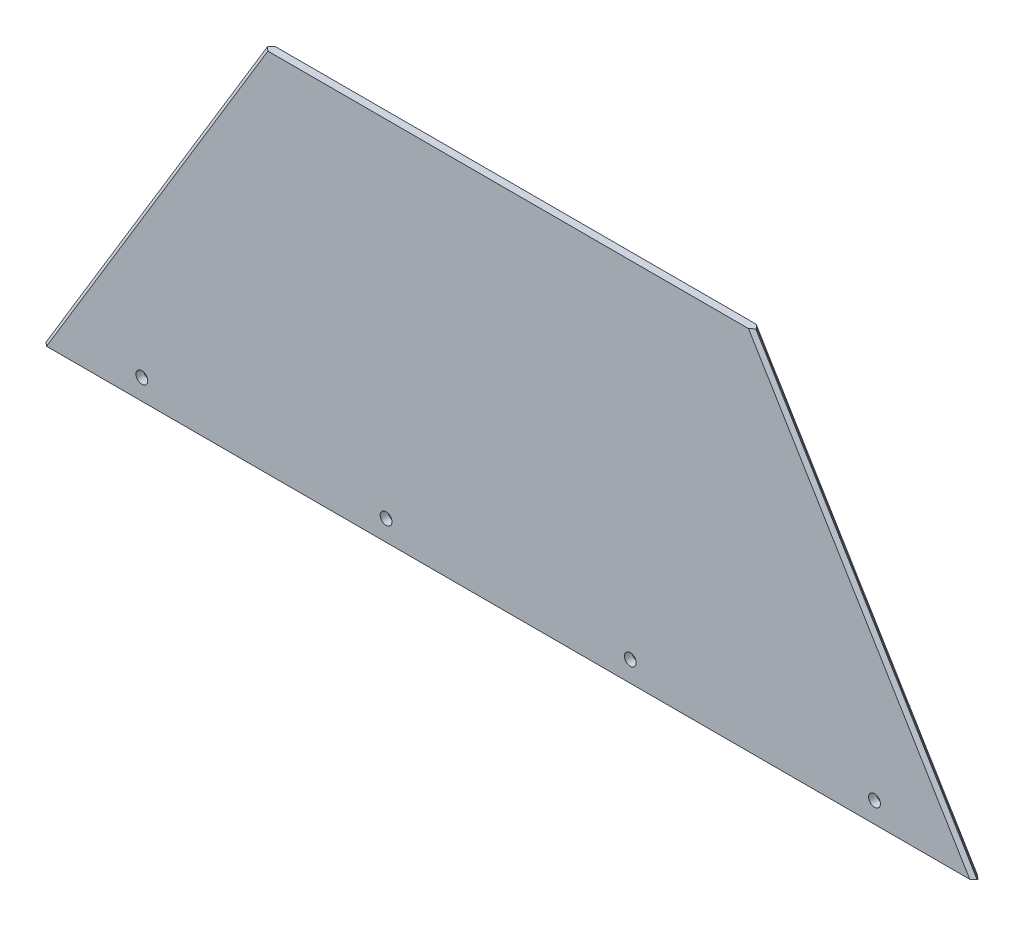
ISO-10303-21;
HEADER;
FILE_DESCRIPTION(('STEP AP214'),'2;1');
FILE_NAME('part.step','',(''),(''),'','','');
FILE_SCHEMA(('AUTOMOTIVE_DESIGN { 1 0 10303 214 1 1 1 1 }'));
ENDSEC;
DATA;
#1=APPLICATION_CONTEXT('core data for automotive mechanical design processes');
#2=APPLICATION_PROTOCOL_DEFINITION('international standard','automotive_design',2000,#1);
#3=PRODUCT_CONTEXT('',#1,'mechanical');
#4=PRODUCT('Part','Part','',(#3));
#5=PRODUCT_RELATED_PRODUCT_CATEGORY('part','',(#4));
#6=PRODUCT_DEFINITION_FORMATION('','',#4);
#7=PRODUCT_DEFINITION_CONTEXT('part definition',#1,'design');
#8=PRODUCT_DEFINITION('design','',#6,#7);
#9=PRODUCT_DEFINITION_SHAPE('','',#8);
#10=(LENGTH_UNIT() NAMED_UNIT(*) SI_UNIT(.MILLI.,.METRE.));
#11=(NAMED_UNIT(*) PLANE_ANGLE_UNIT() SI_UNIT($,.RADIAN.));
#12=(NAMED_UNIT(*) SI_UNIT($,.STERADIAN.) SOLID_ANGLE_UNIT());
#13=UNCERTAINTY_MEASURE_WITH_UNIT(LENGTH_MEASURE(1.E-05),#10,'distance_accuracy_value','');
#14=(GEOMETRIC_REPRESENTATION_CONTEXT(3) GLOBAL_UNCERTAINTY_ASSIGNED_CONTEXT((#13)) GLOBAL_UNIT_ASSIGNED_CONTEXT((#10,
#11,#12)) REPRESENTATION_CONTEXT('',''));
#15=CARTESIAN_POINT('',(0.,0.,0.));
#16=DIRECTION('',(0.,0.,1.));
#17=DIRECTION('',(1.,0.,0.));
#18=AXIS2_PLACEMENT_3D('',#15,#16,#17);
#19=CARTESIAN_POINT('',(0.,0.,1.5875));
#20=DIRECTION('',(0.,1.,0.));
#21=DIRECTION('',(0.,0.,1.));
#22=AXIS2_PLACEMENT_3D('',#19,#20,#21);
#23=PLANE('',#22);
#24=DIRECTION('',(1.,0.,0.));
#25=VECTOR('',#24,1.);
#26=CARTESIAN_POINT('',(0.,0.,-1.5875));
#27=LINE('',#26,#25);
#28=CARTESIAN_POINT('',(-192.042829614562,0.,-1.5875));
#29=VERTEX_POINT('',#28);
#30=CARTESIAN_POINT('',(192.042829614562,0.,-1.58750000000003));
#31=VERTEX_POINT('',#30);
#32=EDGE_CURVE('E170',#29,#31,#27,.T.);
#33=ORIENTED_EDGE('',*,*,#32,.T.);
#34=DIRECTION('',(-0.759717133516372,0.,-0.650253702059179));
#35=VECTOR('',#34,1.);
#36=CARTESIAN_POINT('',(193.675,0.,-0.190499999999963));
#37=LINE('',#36,#35);
#38=CARTESIAN_POINT('',(193.675,0.,-0.190499999999963));
#39=VERTEX_POINT('',#38);
#40=EDGE_CURVE('E144',#31,#39,#37,.F.);
#41=ORIENTED_EDGE('',*,*,#40,.T.);
#42=DIRECTION('',(0.,0.,-1.));
#43=VECTOR('',#42,1.);
#44=CARTESIAN_POINT('',(193.675,0.,1.5875));
#45=LINE('',#44,#43);
#46=CARTESIAN_POINT('',(193.675,0.,0.190499999999958));
#47=VERTEX_POINT('',#46);
#48=EDGE_CURVE('E123',#47,#39,#45,.T.);
#49=ORIENTED_EDGE('',*,*,#48,.F.);
#50=DIRECTION('',(-0.759717133516387,0.,0.650253702059161));
#51=VECTOR('',#50,1.);
#52=CARTESIAN_POINT('',(192.294739193228,0.,1.37188667645438));
#53=LINE('',#52,#51);
#54=CARTESIAN_POINT('',(192.042829614562,0.,1.58750000000006));
#55=VERTEX_POINT('',#54);
#56=EDGE_CURVE('E128',#47,#55,#53,.T.);
#57=ORIENTED_EDGE('',*,*,#56,.T.);
#58=DIRECTION('',(1.,0.,0.));
#59=VECTOR('',#58,1.);
#60=CARTESIAN_POINT('',(-193.675,0.,1.5875));
#61=LINE('',#60,#59);
#62=CARTESIAN_POINT('',(-192.042829614562,0.,1.58749999999999));
#63=VERTEX_POINT('',#62);
#64=EDGE_CURVE('E165',#63,#55,#61,.T.);
#65=ORIENTED_EDGE('',*,*,#64,.F.);
#66=DIRECTION('',(-0.759717133516385,0.,-0.650253702059163));
#67=VECTOR('',#66,1.);
#68=CARTESIAN_POINT('',(-132.5110449374,0.,52.5416797449515));
#69=LINE('',#68,#67);
#70=CARTESIAN_POINT('',(-193.675,0.,0.190499999999851));
#71=VERTEX_POINT('',#70);
#72=EDGE_CURVE('E58',#63,#71,#69,.T.);
#73=ORIENTED_EDGE('',*,*,#72,.T.);
#74=DIRECTION('',(0.,0.,-1.));
#75=VECTOR('',#74,1.);
#76=CARTESIAN_POINT('',(-193.675,0.,1.5875));
#77=LINE('',#76,#75);
#78=CARTESIAN_POINT('',(-193.675,0.,-0.190500000000031));
#79=VERTEX_POINT('',#78);
#80=EDGE_CURVE('E155',#71,#79,#77,.T.);
#81=ORIENTED_EDGE('',*,*,#80,.T.);
#82=DIRECTION('',(-0.759717133516378,0.,0.650253702059172));
#83=VECTOR('',#82,1.);
#84=CARTESIAN_POINT('',(-140.532060928611,0.,-45.6763674958803));
#85=LINE('',#84,#83);
#86=EDGE_CURVE('E51',#79,#29,#85,.F.);
#87=ORIENTED_EDGE('',*,*,#86,.T.);
#88=EDGE_LOOP('',(#33,#41,#49,#57,#65,#73,#81,#87));
#89=FACE_BOUND('',#88,.T.);
#90=ADVANCED_FACE('F36',(#89),#23,.F.);
#91=CARTESIAN_POINT('',(193.675,0.,1.5875));
#92=DIRECTION('',(-0.855915541945791,-0.517115639925582,0.));
#93=DIRECTION('',(0.517115639925582,-0.855915541945791,0.));
#94=AXIS2_PLACEMENT_3D('',#91,#92,#93);
#95=PLANE('',#94);
#96=ORIENTED_EDGE('',*,*,#48,.T.);
#97=DIRECTION('',(-0.517115639925582,0.855915541945791,0.));
#98=VECTOR('',#97,1.);
#99=CARTESIAN_POINT('',(193.675,0.,-0.190499999999965));
#100=LINE('',#99,#98);
#101=CARTESIAN_POINT('',(101.6,152.4,-0.190499999999979));
#102=VERTEX_POINT('',#101);
#103=EDGE_CURVE('E122',#39,#102,#100,.T.);
#104=ORIENTED_EDGE('',*,*,#103,.T.);
#105=DIRECTION('',(0.,0.,-1.));
#106=VECTOR('',#105,1.);
#107=CARTESIAN_POINT('',(101.6,152.4,1.5875));
#108=LINE('',#107,#106);
#109=CARTESIAN_POINT('',(101.6,152.4,0.190499999999963));
#110=VERTEX_POINT('',#109);
#111=EDGE_CURVE('E105',#110,#102,#108,.T.);
#112=ORIENTED_EDGE('',*,*,#111,.F.);
#113=DIRECTION('',(0.517115639925582,-0.855915541945791,0.));
#114=VECTOR('',#113,1.);
#115=CARTESIAN_POINT('',(193.675,0.,0.190499999999963));
#116=LINE('',#115,#114);
#117=EDGE_CURVE('E119',#110,#47,#116,.T.);
#118=ORIENTED_EDGE('',*,*,#117,.T.);
#119=EDGE_LOOP('',(#96,#104,#112,#118));
#120=FACE_BOUND('',#119,.T.);
#121=ADVANCED_FACE('F118',(#120),#95,.F.);
#122=CARTESIAN_POINT('',(0.,152.4,1.5875));
#123=DIRECTION('',(0.,-1.,0.));
#124=DIRECTION('',(0.,0.,-1.));
#125=AXIS2_PLACEMENT_3D('',#122,#123,#124);
#126=PLANE('',#125);
#127=ORIENTED_EDGE('',*,*,#111,.T.);
#128=DIRECTION('',(0.759717133516372,0.,0.650253702059179));
#129=VECTOR('',#128,1.);
#130=CARTESIAN_POINT('',(154.742939071388,152.4,45.2953674958804));
#131=LINE('',#130,#129);
#132=CARTESIAN_POINT('',(99.9678296145621,152.4,-1.5875));
#133=VERTEX_POINT('',#132);
#134=EDGE_CURVE('E112',#102,#133,#131,.F.);
#135=ORIENTED_EDGE('',*,*,#134,.T.);
#136=DIRECTION('',(-1.,0.,0.));
#137=VECTOR('',#136,1.);
#138=CARTESIAN_POINT('',(0.,152.4,-1.5875));
#139=LINE('',#138,#137);
#140=CARTESIAN_POINT('',(-99.967829614562,152.4,-1.58750000000001));
#141=VERTEX_POINT('',#140);
#142=EDGE_CURVE('E167',#133,#141,#139,.T.);
#143=ORIENTED_EDGE('',*,*,#142,.T.);
#144=DIRECTION('',(0.759717133516378,0.,-0.650253702059172));
#145=VECTOR('',#144,1.);
#146=CARTESIAN_POINT('',(-101.6,152.4,-0.190500000000018));
#147=LINE('',#146,#145);
#148=CARTESIAN_POINT('',(-101.6,152.4,-0.190500000000018));
#149=VERTEX_POINT('',#148);
#150=EDGE_CURVE('E113',#141,#149,#147,.F.);
#151=ORIENTED_EDGE('',*,*,#150,.T.);
#152=DIRECTION('',(0.,0.,-1.));
#153=VECTOR('',#152,1.);
#154=CARTESIAN_POINT('',(-101.6,152.4,1.5875));
#155=LINE('',#154,#153);
#156=CARTESIAN_POINT('',(-101.6,152.4,0.190499999999851));
#157=VERTEX_POINT('',#156);
#158=EDGE_CURVE('E124',#157,#149,#155,.T.);
#159=ORIENTED_EDGE('',*,*,#158,.F.);
#160=DIRECTION('',(0.759717133516385,0.,0.650253702059163));
#161=VECTOR('',#160,1.);
#162=CARTESIAN_POINT('',(-93.5789840087907,152.4,7.05581224907148));
#163=LINE('',#162,#161);
#164=CARTESIAN_POINT('',(-99.9678296145618,152.4,1.58750000000001));
#165=VERTEX_POINT('',#164);
#166=EDGE_CURVE('E130',#157,#165,#163,.T.);
#167=ORIENTED_EDGE('',*,*,#166,.T.);
#168=DIRECTION('',(-1.,0.,0.));
#169=VECTOR('',#168,1.);
#170=CARTESIAN_POINT('',(101.6,152.4,1.5875));
#171=LINE('',#170,#169);
#172=CARTESIAN_POINT('',(99.9678296145619,152.4,1.58750000000001));
#173=VERTEX_POINT('',#172);
#174=EDGE_CURVE('E107',#173,#165,#171,.T.);
#175=ORIENTED_EDGE('',*,*,#174,.F.);
#176=DIRECTION('',(0.759717133516387,0.,-0.650253702059161));
#177=VECTOR('',#176,1.);
#178=CARTESIAN_POINT('',(153.362678264619,152.4,-44.1139808194256));
#179=LINE('',#178,#177);
#180=EDGE_CURVE('E102',#173,#110,#179,.T.);
#181=ORIENTED_EDGE('',*,*,#180,.T.);
#182=EDGE_LOOP('',(#127,#135,#143,#151,#159,#167,#175,#181));
#183=FACE_BOUND('',#182,.T.);
#184=ADVANCED_FACE('F104',(#183),#126,.F.);
#185=CARTESIAN_POINT('',(-101.6,152.4,1.5875));
#186=DIRECTION('',(0.85591554194579,-0.517115639925582,0.));
#187=DIRECTION('',(0.517115639925582,0.85591554194579,0.));
#188=AXIS2_PLACEMENT_3D('',#185,#186,#187);
#189=PLANE('',#188);
#190=ORIENTED_EDGE('',*,*,#158,.T.);
#191=DIRECTION('',(-0.517115639925582,-0.85591554194579,0.));
#192=VECTOR('',#191,1.);
#193=CARTESIAN_POINT('',(-101.6,152.4,-0.190500000000041));
#194=LINE('',#193,#192);
#195=EDGE_CURVE('E11',#149,#79,#194,.T.);
#196=ORIENTED_EDGE('',*,*,#195,.T.);
#197=ORIENTED_EDGE('',*,*,#80,.F.);
#198=DIRECTION('',(0.517115639925582,0.85591554194579,0.));
#199=VECTOR('',#198,1.);
#200=CARTESIAN_POINT('',(-101.6,152.4,0.19049999999985));
#201=LINE('',#200,#199);
#202=EDGE_CURVE('E44',#71,#157,#201,.T.);
#203=ORIENTED_EDGE('',*,*,#202,.T.);
#204=EDGE_LOOP('',(#190,#196,#197,#203));
#205=FACE_BOUND('',#204,.T.);
#206=ADVANCED_FACE('F154',(#205),#189,.F.);
#207=CARTESIAN_POINT('',(193.675,0.,1.5875));
#208=DIRECTION('',(0.,0.,1.));
#209=DIRECTION('',(1.,0.,0.));
#210=AXIS2_PLACEMENT_3D('',#207,#208,#209);
#211=PLANE('',#210);
#212=CARTESIAN_POINT('',(-152.4,8.58519999999998,1.58749999999997));
#213=DIRECTION('',(0.,0.,1.));
#214=DIRECTION('',(1.,0.,0.));
#215=AXIS2_PLACEMENT_3D('',#212,#213,#214);
#216=CIRCLE('',#215,2.45745);
#217=CARTESIAN_POINT('',(-149.94255,8.58519999999998,1.58749999999997));
#218=VERTEX_POINT('',#217);
#219=EDGE_CURVE('E300',#218,#218,#216,.T.);
#220=ORIENTED_EDGE('',*,*,#219,.F.);
#221=EDGE_LOOP('',(#220));
#222=FACE_BOUND('',#221,.T.);
#223=CARTESIAN_POINT('',(-50.8,8.58519999999998,1.58749999999998));
#224=DIRECTION('',(0.,0.,1.));
#225=DIRECTION('',(1.,0.,0.));
#226=AXIS2_PLACEMENT_3D('',#223,#224,#225);
#227=CIRCLE('',#226,2.45744999999999);
#228=CARTESIAN_POINT('',(-48.34255,8.58519999999998,1.58749999999998));
#229=VERTEX_POINT('',#228);
#230=EDGE_CURVE('E295',#229,#229,#227,.T.);
#231=ORIENTED_EDGE('',*,*,#230,.F.);
#232=EDGE_LOOP('',(#231));
#233=FACE_BOUND('',#232,.T.);
#234=CARTESIAN_POINT('',(152.4,8.5852,1.5875));
#235=DIRECTION('',(0.,0.,1.));
#236=DIRECTION('',(1.,0.,0.));
#237=AXIS2_PLACEMENT_3D('',#234,#235,#236);
#238=CIRCLE('',#237,2.45745);
#239=CARTESIAN_POINT('',(154.85745,8.5852,1.5875));
#240=VERTEX_POINT('',#239);
#241=EDGE_CURVE('E287',#240,#240,#238,.T.);
#242=ORIENTED_EDGE('',*,*,#241,.F.);
#243=EDGE_LOOP('',(#242));
#244=FACE_BOUND('',#243,.T.);
#245=CARTESIAN_POINT('',(50.8,8.58519999999998,1.5875));
#246=DIRECTION('',(0.,0.,1.));
#247=DIRECTION('',(1.,0.,0.));
#248=AXIS2_PLACEMENT_3D('',#245,#246,#247);
#249=CIRCLE('',#248,2.45744999999999);
#250=CARTESIAN_POINT('',(53.25745,8.58519999999998,1.5875));
#251=VERTEX_POINT('',#250);
#252=EDGE_CURVE('E283',#251,#251,#249,.T.);
#253=ORIENTED_EDGE('',*,*,#252,.F.);
#254=EDGE_LOOP('',(#253));
#255=FACE_BOUND('',#254,.T.);
#256=ORIENTED_EDGE('',*,*,#64,.T.);
#257=DIRECTION('',(-0.517115639925582,0.855915541945791,0.));
#258=VECTOR('',#257,1.);
#259=CARTESIAN_POINT('',(100.404285987902,151.677589451024,1.5875));
#260=LINE('',#259,#258);
#261=EDGE_CURVE('E149',#55,#173,#260,.T.);
#262=ORIENTED_EDGE('',*,*,#261,.T.);
#263=ORIENTED_EDGE('',*,*,#174,.T.);
#264=DIRECTION('',(-0.517115639925582,-0.85591554194579,0.));
#265=VECTOR('',#264,1.);
#266=CARTESIAN_POINT('',(-192.479285987902,-0.722410548976133,1.5875));
#267=LINE('',#266,#265);
#268=EDGE_CURVE('E146',#165,#63,#267,.T.);
#269=ORIENTED_EDGE('',*,*,#268,.T.);
#270=EDGE_LOOP('',(#256,#262,#263,#269));
#271=FACE_BOUND('',#270,.T.);
#272=ADVANCED_FACE('F164',(#222,#233,#244,#255,#271),#211,.T.);
#273=CARTESIAN_POINT('',(193.675,0.,-1.5875));
#274=DIRECTION('',(0.,0.,1.));
#275=DIRECTION('',(1.,0.,0.));
#276=AXIS2_PLACEMENT_3D('',#273,#274,#275);
#277=PLANE('',#276);
#278=CARTESIAN_POINT('',(-152.4,8.58519999999998,-1.58750000000007));
#279=DIRECTION('',(0.,0.,1.));
#280=DIRECTION('',(1.,0.,0.));
#281=AXIS2_PLACEMENT_3D('',#278,#279,#280);
#282=CIRCLE('',#281,2.45745);
#283=CARTESIAN_POINT('',(-149.94255,8.58519999999998,-1.58750000000007));
#284=VERTEX_POINT('',#283);
#285=EDGE_CURVE('E298',#284,#284,#282,.T.);
#286=ORIENTED_EDGE('',*,*,#285,.T.);
#287=EDGE_LOOP('',(#286));
#288=FACE_BOUND('',#287,.T.);
#289=CARTESIAN_POINT('',(-50.8,8.58519999999998,-1.58750000000006));
#290=DIRECTION('',(0.,0.,1.));
#291=DIRECTION('',(1.,0.,0.));
#292=AXIS2_PLACEMENT_3D('',#289,#290,#291);
#293=CIRCLE('',#292,2.45745);
#294=CARTESIAN_POINT('',(-48.34255,8.58519999999998,-1.58750000000006));
#295=VERTEX_POINT('',#294);
#296=EDGE_CURVE('E292',#295,#295,#293,.T.);
#297=ORIENTED_EDGE('',*,*,#296,.T.);
#298=EDGE_LOOP('',(#297));
#299=FACE_BOUND('',#298,.T.);
#300=CARTESIAN_POINT('',(152.4,8.5852,-1.58750000000004));
#301=DIRECTION('',(0.,0.,1.));
#302=DIRECTION('',(1.,0.,0.));
#303=AXIS2_PLACEMENT_3D('',#300,#301,#302);
#304=CIRCLE('',#303,2.45745);
#305=CARTESIAN_POINT('',(154.85745,8.5852,-1.58750000000004));
#306=VERTEX_POINT('',#305);
#307=EDGE_CURVE('E285',#306,#306,#304,.T.);
#308=ORIENTED_EDGE('',*,*,#307,.T.);
#309=EDGE_LOOP('',(#308));
#310=FACE_BOUND('',#309,.T.);
#311=CARTESIAN_POINT('',(50.8,8.58519999999998,-1.58750000000004));
#312=DIRECTION('',(0.,0.,1.));
#313=DIRECTION('',(1.,0.,0.));
#314=AXIS2_PLACEMENT_3D('',#311,#312,#313);
#315=CIRCLE('',#314,2.45745);
#316=CARTESIAN_POINT('',(53.25745,8.58519999999998,-1.58750000000004));
#317=VERTEX_POINT('',#316);
#318=EDGE_CURVE('E173',#317,#317,#315,.T.);
#319=ORIENTED_EDGE('',*,*,#318,.T.);
#320=EDGE_LOOP('',(#319));
#321=FACE_BOUND('',#320,.T.);
#322=ORIENTED_EDGE('',*,*,#142,.F.);
#323=DIRECTION('',(0.517115639925582,-0.855915541945791,0.));
#324=VECTOR('',#323,1.);
#325=CARTESIAN_POINT('',(192.479285987902,-0.722410548976045,-1.5875));
#326=LINE('',#325,#324);
#327=EDGE_CURVE('E139',#133,#31,#326,.T.);
#328=ORIENTED_EDGE('',*,*,#327,.T.);
#329=ORIENTED_EDGE('',*,*,#32,.F.);
#330=DIRECTION('',(0.517115639925582,0.85591554194579,0.));
#331=VECTOR('',#330,1.);
#332=CARTESIAN_POINT('',(-88.8985705665981,170.72153221732,-1.5875));
#333=LINE('',#332,#331);
#334=EDGE_CURVE('E137',#29,#141,#333,.T.);
#335=ORIENTED_EDGE('',*,*,#334,.T.);
#336=EDGE_LOOP('',(#322,#328,#329,#335));
#337=FACE_BOUND('',#336,.T.);
#338=ADVANCED_FACE('F181',(#288,#299,#310,#321,#337),#277,.F.);
#339=CARTESIAN_POINT('',(193.675,0.,-0.190499999999963));
#340=DIRECTION('',(-0.605223683832832,-0.365655975649003,0.707106781186542));
#341=DIRECTION('',(0.759717133516372,0.,0.650253702059179));
#342=AXIS2_PLACEMENT_3D('',#339,#340,#341);
#343=PLANE('',#342);
#344=ORIENTED_EDGE('',*,*,#40,.F.);
#345=ORIENTED_EDGE('',*,*,#327,.F.);
#346=ORIENTED_EDGE('',*,*,#134,.F.);
#347=ORIENTED_EDGE('',*,*,#103,.F.);
#348=EDGE_LOOP('',(#344,#345,#346,#347));
#349=FACE_BOUND('',#348,.T.);
#350=ADVANCED_FACE('F190',(#349),#343,.F.);
#351=CARTESIAN_POINT('',(192.479285987902,-0.722410548976078,1.5875));
#352=DIRECTION('',(0.605223683832818,0.365655975648994,0.707106781186558));
#353=DIRECTION('',(0.759717133516387,0.,-0.650253702059161));
#354=AXIS2_PLACEMENT_3D('',#351,#352,#353);
#355=PLANE('',#354);
#356=ORIENTED_EDGE('',*,*,#56,.F.);
#357=ORIENTED_EDGE('',*,*,#117,.F.);
#358=ORIENTED_EDGE('',*,*,#180,.F.);
#359=ORIENTED_EDGE('',*,*,#261,.F.);
#360=EDGE_LOOP('',(#356,#357,#358,#359));
#361=FACE_BOUND('',#360,.T.);
#362=ADVANCED_FACE('F127',(#361),#355,.T.);
#363=CARTESIAN_POINT('',(-101.6,152.4,-0.190500000000018));
#364=DIRECTION('',(0.605223683832827,-0.365655975649,0.707106781186548));
#365=DIRECTION('',(0.759717133516378,0.,-0.650253702059172));
#366=AXIS2_PLACEMENT_3D('',#363,#364,#365);
#367=PLANE('',#366);
#368=ORIENTED_EDGE('',*,*,#150,.F.);
#369=ORIENTED_EDGE('',*,*,#334,.F.);
#370=ORIENTED_EDGE('',*,*,#86,.F.);
#371=ORIENTED_EDGE('',*,*,#195,.F.);
#372=EDGE_LOOP('',(#368,#369,#370,#371));
#373=FACE_BOUND('',#372,.T.);
#374=ADVANCED_FACE('F183',(#373),#367,.F.);
#375=CARTESIAN_POINT('',(-88.8985705665979,170.72153221732,1.5875));
#376=DIRECTION('',(-0.60522368383282,0.365655975648995,0.707106781186556));
#377=DIRECTION('',(0.759717133516385,0.,0.650253702059163));
#378=AXIS2_PLACEMENT_3D('',#375,#376,#377);
#379=PLANE('',#378);
#380=ORIENTED_EDGE('',*,*,#166,.F.);
#381=ORIENTED_EDGE('',*,*,#202,.F.);
#382=ORIENTED_EDGE('',*,*,#72,.F.);
#383=ORIENTED_EDGE('',*,*,#268,.F.);
#384=EDGE_LOOP('',(#380,#381,#382,#383));
#385=FACE_BOUND('',#384,.T.);
#386=ADVANCED_FACE('F38',(#385),#379,.T.);
#387=CARTESIAN_POINT('',(50.8,8.58519999999998,1.5875));
#388=DIRECTION('',(0.,0.,1.));
#389=DIRECTION('',(1.,0.,0.));
#390=AXIS2_PLACEMENT_3D('',#387,#388,#389);
#391=CYLINDRICAL_SURFACE('',#390,2.45744999999999);
#392=ORIENTED_EDGE('',*,*,#318,.F.);
#393=EDGE_LOOP('',(#392));
#394=FACE_BOUND('',#393,.T.);
#395=ORIENTED_EDGE('',*,*,#252,.T.);
#396=EDGE_LOOP('',(#395));
#397=FACE_BOUND('',#396,.T.);
#398=ADVANCED_FACE('F189',(#394,#397),#391,.F.);
#399=CARTESIAN_POINT('',(152.4,8.5852,1.5875));
#400=DIRECTION('',(0.,0.,1.));
#401=DIRECTION('',(1.,0.,0.));
#402=AXIS2_PLACEMENT_3D('',#399,#400,#401);
#403=CYLINDRICAL_SURFACE('',#402,2.45745);
#404=ORIENTED_EDGE('',*,*,#307,.F.);
#405=EDGE_LOOP('',(#404));
#406=FACE_BOUND('',#405,.T.);
#407=ORIENTED_EDGE('',*,*,#241,.T.);
#408=EDGE_LOOP('',(#407));
#409=FACE_BOUND('',#408,.T.);
#410=ADVANCED_FACE('F245',(#406,#409),#403,.F.);
#411=CARTESIAN_POINT('',(-50.8,8.58519999999998,1.58749999999998));
#412=DIRECTION('',(0.,0.,1.));
#413=DIRECTION('',(1.,0.,0.));
#414=AXIS2_PLACEMENT_3D('',#411,#412,#413);
#415=CYLINDRICAL_SURFACE('',#414,2.45744999999999);
#416=ORIENTED_EDGE('',*,*,#296,.F.);
#417=EDGE_LOOP('',(#416));
#418=FACE_BOUND('',#417,.T.);
#419=ORIENTED_EDGE('',*,*,#230,.T.);
#420=EDGE_LOOP('',(#419));
#421=FACE_BOUND('',#420,.T.);
#422=ADVANCED_FACE('F250',(#418,#421),#415,.F.);
#423=CARTESIAN_POINT('',(-152.4,8.58519999999998,1.58749999999997));
#424=DIRECTION('',(0.,0.,1.));
#425=DIRECTION('',(1.,0.,0.));
#426=AXIS2_PLACEMENT_3D('',#423,#424,#425);
#427=CYLINDRICAL_SURFACE('',#426,2.45745);
#428=ORIENTED_EDGE('',*,*,#285,.F.);
#429=EDGE_LOOP('',(#428));
#430=FACE_BOUND('',#429,.T.);
#431=ORIENTED_EDGE('',*,*,#219,.T.);
#432=EDGE_LOOP('',(#431));
#433=FACE_BOUND('',#432,.T.);
#434=ADVANCED_FACE('F260',(#430,#433),#427,.F.);
#435=CLOSED_SHELL('',(#90,#121,#184,#206,#272,#338,#350,#362,#374,#386,#398,#410,#422,#434));
#436=MANIFOLD_SOLID_BREP('B2',#435);
#437=ADVANCED_BREP_SHAPE_REPRESENTATION('',(#18,#436),#14);
#438=SHAPE_DEFINITION_REPRESENTATION(#9,#437);
ENDSEC;
END-ISO-10303-21;
